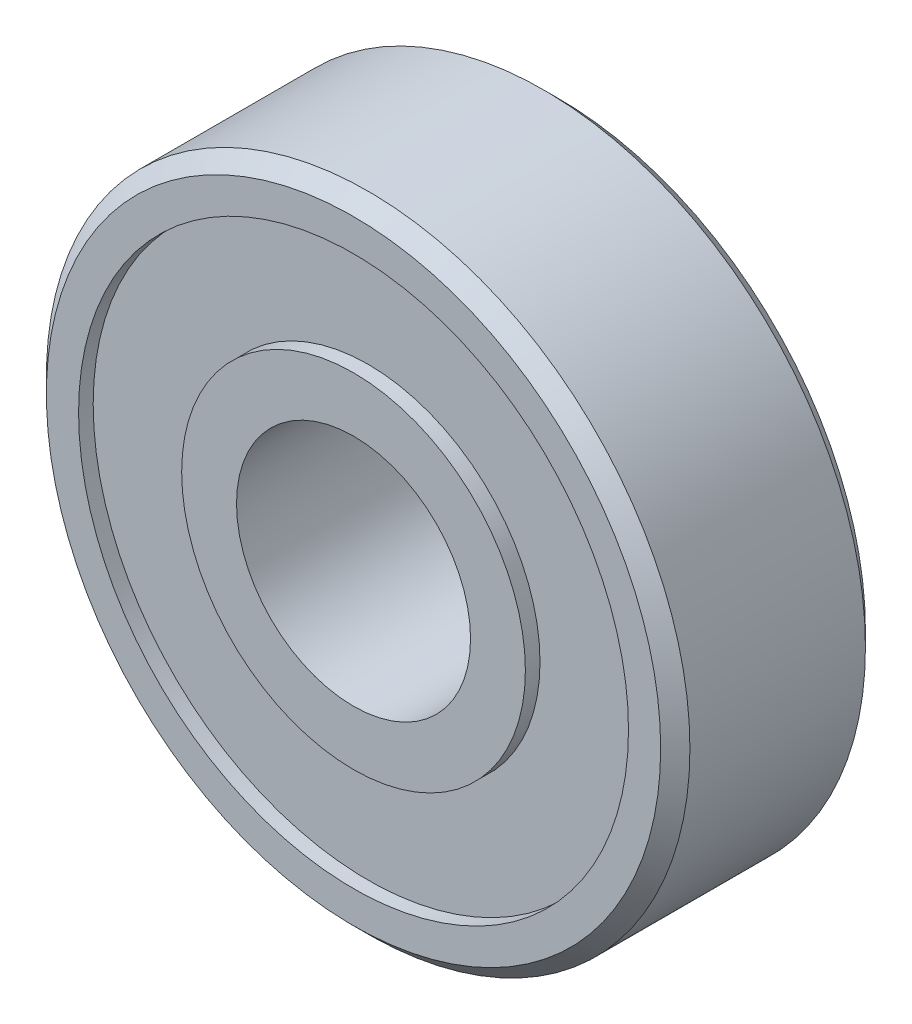
ISO-10303-21;
HEADER;
FILE_DESCRIPTION(('STEP AP214'),'2;1');
FILE_NAME('part.step','',(''),(''),'','','');
FILE_SCHEMA(('AUTOMOTIVE_DESIGN { 1 0 10303 214 1 1 1 1 }'));
ENDSEC;
DATA;
#1=APPLICATION_CONTEXT('core data for automotive mechanical design processes');
#2=APPLICATION_PROTOCOL_DEFINITION('international standard','automotive_design',2000,#1);
#3=PRODUCT_CONTEXT('',#1,'mechanical');
#4=PRODUCT('Part','Part','',(#3));
#5=PRODUCT_RELATED_PRODUCT_CATEGORY('part','',(#4));
#6=PRODUCT_DEFINITION_FORMATION('','',#4);
#7=PRODUCT_DEFINITION_CONTEXT('part definition',#1,'design');
#8=PRODUCT_DEFINITION('design','',#6,#7);
#9=PRODUCT_DEFINITION_SHAPE('','',#8);
#10=(LENGTH_UNIT() NAMED_UNIT(*) SI_UNIT(.MILLI.,.METRE.));
#11=(NAMED_UNIT(*) PLANE_ANGLE_UNIT() SI_UNIT($,.RADIAN.));
#12=(NAMED_UNIT(*) SI_UNIT($,.STERADIAN.) SOLID_ANGLE_UNIT());
#13=UNCERTAINTY_MEASURE_WITH_UNIT(LENGTH_MEASURE(1.E-05),#10,'distance_accuracy_value','');
#14=(GEOMETRIC_REPRESENTATION_CONTEXT(3) GLOBAL_UNCERTAINTY_ASSIGNED_CONTEXT((#13)) GLOBAL_UNIT_ASSIGNED_CONTEXT((#10,
#11,#12)) REPRESENTATION_CONTEXT('',''));
#15=CARTESIAN_POINT('',(0.,0.,0.));
#16=DIRECTION('',(0.,0.,1.));
#17=DIRECTION('',(1.,0.,0.));
#18=AXIS2_PLACEMENT_3D('',#15,#16,#17);
#19=CARTESIAN_POINT('',(0.,0.,-3.5));
#20=DIRECTION('',(0.,0.,1.));
#21=DIRECTION('',(1.,0.,0.));
#22=AXIS2_PLACEMENT_3D('',#19,#20,#21);
#23=PLANE('',#22);
#24=CARTESIAN_POINT('',(0.,0.,-3.5));
#25=DIRECTION('',(0.,0.,1.));
#26=DIRECTION('',(1.,0.,0.));
#27=AXIS2_PLACEMENT_3D('',#24,#25,#26);
#28=CIRCLE('',#27,4.);
#29=CARTESIAN_POINT('',(4.,0.,-3.5));
#30=VERTEX_POINT('',#29);
#31=EDGE_CURVE('E54',#30,#30,#28,.T.);
#32=ORIENTED_EDGE('',*,*,#31,.T.);
#33=EDGE_LOOP('',(#32));
#34=FACE_BOUND('',#33,.T.);
#35=CARTESIAN_POINT('',(0.,0.,-3.5));
#36=DIRECTION('',(0.,0.,-1.));
#37=DIRECTION('',(-1.,0.,0.));
#38=AXIS2_PLACEMENT_3D('',#35,#36,#37);
#39=CIRCLE('',#38,5.875);
#40=CARTESIAN_POINT('',(-5.875,0.,-3.5));
#41=VERTEX_POINT('',#40);
#42=EDGE_CURVE('E78',#41,#41,#39,.T.);
#43=ORIENTED_EDGE('',*,*,#42,.T.);
#44=EDGE_LOOP('',(#43));
#45=FACE_BOUND('',#44,.T.);
#46=ADVANCED_FACE('F33',(#34,#45),#23,.F.);
#47=CARTESIAN_POINT('',(0.,0.,3.5));
#48=DIRECTION('',(0.,0.,1.));
#49=DIRECTION('',(1.,0.,0.));
#50=AXIS2_PLACEMENT_3D('',#47,#48,#49);
#51=PLANE('',#50);
#52=CARTESIAN_POINT('',(0.,0.,3.5));
#53=DIRECTION('',(0.,0.,1.));
#54=DIRECTION('',(1.,0.,0.));
#55=AXIS2_PLACEMENT_3D('',#52,#53,#54);
#56=CIRCLE('',#55,4.);
#57=CARTESIAN_POINT('',(4.,0.,3.5));
#58=VERTEX_POINT('',#57);
#59=EDGE_CURVE('E53',#58,#58,#56,.T.);
#60=ORIENTED_EDGE('',*,*,#59,.F.);
#61=EDGE_LOOP('',(#60));
#62=FACE_BOUND('',#61,.T.);
#63=CARTESIAN_POINT('',(0.,0.,3.5));
#64=DIRECTION('',(0.,0.,1.));
#65=DIRECTION('',(1.,0.,0.));
#66=AXIS2_PLACEMENT_3D('',#63,#64,#65);
#67=CIRCLE('',#66,5.875);
#68=CARTESIAN_POINT('',(5.875,0.,3.5));
#69=VERTEX_POINT('',#68);
#70=EDGE_CURVE('E66',#69,#69,#67,.T.);
#71=ORIENTED_EDGE('',*,*,#70,.T.);
#72=EDGE_LOOP('',(#71));
#73=FACE_BOUND('',#72,.T.);
#74=ADVANCED_FACE('F112',(#62,#73),#51,.T.);
#75=CARTESIAN_POINT('',(0.,0.,3.5));
#76=DIRECTION('',(0.,0.,1.));
#77=DIRECTION('',(1.,0.,0.));
#78=AXIS2_PLACEMENT_3D('',#75,#76,#77);
#79=CIRCLE('',#78,10.5);
#80=CARTESIAN_POINT('',(10.5,0.,3.5));
#81=VERTEX_POINT('',#80);
#82=EDGE_CURVE('E10',#81,#81,#79,.T.);
#83=ORIENTED_EDGE('',*,*,#82,.T.);
#84=EDGE_LOOP('',(#83));
#85=FACE_BOUND('',#84,.T.);
#86=CARTESIAN_POINT('',(0.,0.,3.5));
#87=DIRECTION('',(0.,0.,1.));
#88=DIRECTION('',(1.,0.,0.));
#89=AXIS2_PLACEMENT_3D('',#86,#87,#88);
#90=CIRCLE('',#89,9.4);
#91=CARTESIAN_POINT('',(9.4,0.,3.5));
#92=VERTEX_POINT('',#91);
#93=EDGE_CURVE('E60',#92,#92,#90,.T.);
#94=ORIENTED_EDGE('',*,*,#93,.F.);
#95=EDGE_LOOP('',(#94));
#96=FACE_BOUND('',#95,.T.);
#97=ADVANCED_FACE('F103',(#85,#96),#51,.T.);
#98=CARTESIAN_POINT('',(0.,0.,-3.5));
#99=DIRECTION('',(0.,0.,1.));
#100=DIRECTION('',(1.,0.,0.));
#101=AXIS2_PLACEMENT_3D('',#98,#99,#100);
#102=CIRCLE('',#101,10.5);
#103=CARTESIAN_POINT('',(10.5,0.,-3.5));
#104=VERTEX_POINT('',#103);
#105=EDGE_CURVE('E40',#104,#104,#102,.F.);
#106=ORIENTED_EDGE('',*,*,#105,.T.);
#107=EDGE_LOOP('',(#106));
#108=FACE_BOUND('',#107,.T.);
#109=CARTESIAN_POINT('',(0.,0.,-3.5));
#110=DIRECTION('',(0.,0.,-1.));
#111=DIRECTION('',(-1.,0.,0.));
#112=AXIS2_PLACEMENT_3D('',#109,#110,#111);
#113=CIRCLE('',#112,9.4);
#114=CARTESIAN_POINT('',(-9.4,0.,-3.5));
#115=VERTEX_POINT('',#114);
#116=EDGE_CURVE('E72',#115,#115,#113,.T.);
#117=ORIENTED_EDGE('',*,*,#116,.F.);
#118=EDGE_LOOP('',(#117));
#119=FACE_BOUND('',#118,.T.);
#120=ADVANCED_FACE('F100',(#108,#119),#23,.F.);
#121=CARTESIAN_POINT('',(0.,0.,3.5));
#122=DIRECTION('',(0.,0.,-1.));
#123=DIRECTION('',(-1.,0.,0.));
#124=AXIS2_PLACEMENT_3D('',#121,#122,#123);
#125=CYLINDRICAL_SURFACE('',#124,11.);
#126=CARTESIAN_POINT('',(0.,0.,-3.));
#127=DIRECTION('',(0.,0.,1.));
#128=DIRECTION('',(1.,0.,0.));
#129=AXIS2_PLACEMENT_3D('',#126,#127,#128);
#130=CIRCLE('',#129,11.);
#131=CARTESIAN_POINT('',(11.,0.,-3.));
#132=VERTEX_POINT('',#131);
#133=EDGE_CURVE('E44',#132,#132,#130,.T.);
#134=ORIENTED_EDGE('',*,*,#133,.T.);
#135=EDGE_LOOP('',(#134));
#136=FACE_BOUND('',#135,.T.);
#137=CARTESIAN_POINT('',(0.,0.,3.));
#138=DIRECTION('',(0.,0.,1.));
#139=DIRECTION('',(1.,0.,0.));
#140=AXIS2_PLACEMENT_3D('',#137,#138,#139);
#141=CIRCLE('',#140,11.);
#142=CARTESIAN_POINT('',(11.,0.,3.));
#143=VERTEX_POINT('',#142);
#144=EDGE_CURVE('E48',#143,#143,#141,.F.);
#145=ORIENTED_EDGE('',*,*,#144,.T.);
#146=EDGE_LOOP('',(#145));
#147=FACE_BOUND('',#146,.T.);
#148=ADVANCED_FACE('F102',(#136,#147),#125,.T.);
#149=CARTESIAN_POINT('',(0.,0.,3.5));
#150=DIRECTION('',(0.,0.,-1.));
#151=DIRECTION('',(-1.,0.,0.));
#152=AXIS2_PLACEMENT_3D('',#149,#150,#151);
#153=CYLINDRICAL_SURFACE('',#152,4.);
#154=ORIENTED_EDGE('',*,*,#59,.T.);
#155=EDGE_LOOP('',(#154));
#156=FACE_BOUND('',#155,.T.);
#157=ORIENTED_EDGE('',*,*,#31,.F.);
#158=EDGE_LOOP('',(#157));
#159=FACE_BOUND('',#158,.T.);
#160=ADVANCED_FACE('F109',(#156,#159),#153,.F.);
#161=CARTESIAN_POINT('',(0.,0.,3.));
#162=DIRECTION('',(0.,0.,1.));
#163=DIRECTION('',(1.,0.,0.));
#164=AXIS2_PLACEMENT_3D('',#161,#162,#163);
#165=CYLINDRICAL_SURFACE('',#164,9.4);
#166=CARTESIAN_POINT('',(0.,0.,3.));
#167=DIRECTION('',(0.,0.,1.));
#168=DIRECTION('',(1.,0.,0.));
#169=AXIS2_PLACEMENT_3D('',#166,#167,#168);
#170=CIRCLE('',#169,9.4);
#171=CARTESIAN_POINT('',(9.4,0.,3.));
#172=VERTEX_POINT('',#171);
#173=EDGE_CURVE('E57',#172,#172,#170,.T.);
#174=ORIENTED_EDGE('',*,*,#173,.F.);
#175=EDGE_LOOP('',(#174));
#176=FACE_BOUND('',#175,.T.);
#177=ORIENTED_EDGE('',*,*,#93,.T.);
#178=EDGE_LOOP('',(#177));
#179=FACE_BOUND('',#178,.T.);
#180=ADVANCED_FACE('F137',(#176,#179),#165,.F.);
#181=CARTESIAN_POINT('',(0.,0.,3.));
#182=DIRECTION('',(0.,0.,1.));
#183=DIRECTION('',(1.,0.,0.));
#184=AXIS2_PLACEMENT_3D('',#181,#182,#183);
#185=PLANE('',#184);
#186=CARTESIAN_POINT('',(0.,0.,3.));
#187=DIRECTION('',(0.,0.,1.));
#188=DIRECTION('',(1.,0.,0.));
#189=AXIS2_PLACEMENT_3D('',#186,#187,#188);
#190=CIRCLE('',#189,5.875);
#191=CARTESIAN_POINT('',(5.875,0.,3.));
#192=VERTEX_POINT('',#191);
#193=EDGE_CURVE('E63',#192,#192,#190,.T.);
#194=ORIENTED_EDGE('',*,*,#193,.F.);
#195=EDGE_LOOP('',(#194));
#196=FACE_BOUND('',#195,.T.);
#197=ORIENTED_EDGE('',*,*,#173,.T.);
#198=EDGE_LOOP('',(#197));
#199=FACE_BOUND('',#198,.T.);
#200=ADVANCED_FACE('F133',(#196,#199),#185,.T.);
#201=CARTESIAN_POINT('',(0.,0.,3.));
#202=DIRECTION('',(0.,0.,1.));
#203=DIRECTION('',(1.,0.,0.));
#204=AXIS2_PLACEMENT_3D('',#201,#202,#203);
#205=CYLINDRICAL_SURFACE('',#204,5.875);
#206=ORIENTED_EDGE('',*,*,#193,.T.);
#207=EDGE_LOOP('',(#206));
#208=FACE_BOUND('',#207,.T.);
#209=ORIENTED_EDGE('',*,*,#70,.F.);
#210=EDGE_LOOP('',(#209));
#211=FACE_BOUND('',#210,.T.);
#212=ADVANCED_FACE('F96',(#208,#211),#205,.T.);
#213=CARTESIAN_POINT('',(0.,0.,-2.5));
#214=DIRECTION('',(0.,0.,-1.));
#215=DIRECTION('',(-1.,0.,0.));
#216=AXIS2_PLACEMENT_3D('',#213,#214,#215);
#217=CYLINDRICAL_SURFACE('',#216,9.4);
#218=CARTESIAN_POINT('',(0.,0.,-2.5));
#219=DIRECTION('',(0.,0.,-1.));
#220=DIRECTION('',(-1.,0.,0.));
#221=AXIS2_PLACEMENT_3D('',#218,#219,#220);
#222=CIRCLE('',#221,9.4);
#223=CARTESIAN_POINT('',(-9.4,0.,-2.5));
#224=VERTEX_POINT('',#223);
#225=EDGE_CURVE('E69',#224,#224,#222,.T.);
#226=ORIENTED_EDGE('',*,*,#225,.F.);
#227=EDGE_LOOP('',(#226));
#228=FACE_BOUND('',#227,.T.);
#229=ORIENTED_EDGE('',*,*,#116,.T.);
#230=EDGE_LOOP('',(#229));
#231=FACE_BOUND('',#230,.T.);
#232=ADVANCED_FACE('F90',(#228,#231),#217,.F.);
#233=CARTESIAN_POINT('',(0.,0.,-2.5));
#234=DIRECTION('',(0.,0.,-1.));
#235=DIRECTION('',(-1.,0.,0.));
#236=AXIS2_PLACEMENT_3D('',#233,#234,#235);
#237=PLANE('',#236);
#238=CARTESIAN_POINT('',(0.,0.,-2.5));
#239=DIRECTION('',(0.,0.,-1.));
#240=DIRECTION('',(-1.,0.,0.));
#241=AXIS2_PLACEMENT_3D('',#238,#239,#240);
#242=CIRCLE('',#241,5.875);
#243=CARTESIAN_POINT('',(-5.875,0.,-2.5));
#244=VERTEX_POINT('',#243);
#245=EDGE_CURVE('E75',#244,#244,#242,.T.);
#246=ORIENTED_EDGE('',*,*,#245,.F.);
#247=EDGE_LOOP('',(#246));
#248=FACE_BOUND('',#247,.T.);
#249=ORIENTED_EDGE('',*,*,#225,.T.);
#250=EDGE_LOOP('',(#249));
#251=FACE_BOUND('',#250,.T.);
#252=ADVANCED_FACE('F87',(#248,#251),#237,.T.);
#253=CARTESIAN_POINT('',(0.,0.,-2.5));
#254=DIRECTION('',(0.,0.,-1.));
#255=DIRECTION('',(-1.,0.,0.));
#256=AXIS2_PLACEMENT_3D('',#253,#254,#255);
#257=CYLINDRICAL_SURFACE('',#256,5.875);
#258=ORIENTED_EDGE('',*,*,#245,.T.);
#259=EDGE_LOOP('',(#258));
#260=FACE_BOUND('',#259,.T.);
#261=ORIENTED_EDGE('',*,*,#42,.F.);
#262=EDGE_LOOP('',(#261));
#263=FACE_BOUND('',#262,.T.);
#264=ADVANCED_FACE('F84',(#260,#263),#257,.T.);
#265=CARTESIAN_POINT('',(0.,0.,-3.));
#266=DIRECTION('',(0.,0.,1.));
#267=DIRECTION('',(1.,0.,0.));
#268=AXIS2_PLACEMENT_3D('',#265,#266,#267);
#269=CONICAL_SURFACE('',#268,11.,0.785398163397452);
#270=ORIENTED_EDGE('',*,*,#105,.F.);
#271=EDGE_LOOP('',(#270));
#272=FACE_BOUND('',#271,.T.);
#273=ORIENTED_EDGE('',*,*,#133,.F.);
#274=EDGE_LOOP('',(#273));
#275=FACE_BOUND('',#274,.T.);
#276=ADVANCED_FACE('F124',(#272,#275),#269,.T.);
#277=CARTESIAN_POINT('',(0.,0.,3.5));
#278=DIRECTION('',(0.,0.,-1.));
#279=DIRECTION('',(-1.,0.,0.));
#280=AXIS2_PLACEMENT_3D('',#277,#278,#279);
#281=CONICAL_SURFACE('',#280,10.5,0.785398163397448);
#282=ORIENTED_EDGE('',*,*,#144,.F.);
#283=EDGE_LOOP('',(#282));
#284=FACE_BOUND('',#283,.T.);
#285=ORIENTED_EDGE('',*,*,#82,.F.);
#286=EDGE_LOOP('',(#285));
#287=FACE_BOUND('',#286,.T.);
#288=ADVANCED_FACE('F35',(#284,#287),#281,.T.);
#289=CLOSED_SHELL('',(#46,#74,#97,#120,#148,#160,#180,#200,#212,#232,#252,#264,#276,#288));
#290=MANIFOLD_SOLID_BREP('B2',#289);
#291=ADVANCED_BREP_SHAPE_REPRESENTATION('',(#18,#290),#14);
#292=SHAPE_DEFINITION_REPRESENTATION(#9,#291);
ENDSEC;
END-ISO-10303-21;
